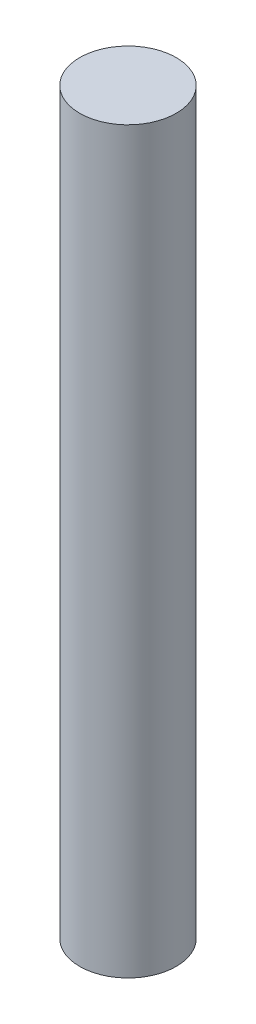
ISO-10303-21;
HEADER;
FILE_DESCRIPTION(('STEP AP214'),'2;1');
FILE_NAME('part.step','',(''),(''),'','','');
FILE_SCHEMA(('AUTOMOTIVE_DESIGN { 1 0 10303 214 1 1 1 1 }'));
ENDSEC;
DATA;
#1=APPLICATION_CONTEXT('core data for automotive mechanical design processes');
#2=APPLICATION_PROTOCOL_DEFINITION('international standard','automotive_design',2000,#1);
#3=PRODUCT_CONTEXT('',#1,'mechanical');
#4=PRODUCT('Part','Part','',(#3));
#5=PRODUCT_RELATED_PRODUCT_CATEGORY('part','',(#4));
#6=PRODUCT_DEFINITION_FORMATION('','',#4);
#7=PRODUCT_DEFINITION_CONTEXT('part definition',#1,'design');
#8=PRODUCT_DEFINITION('design','',#6,#7);
#9=PRODUCT_DEFINITION_SHAPE('','',#8);
#10=(LENGTH_UNIT() NAMED_UNIT(*) SI_UNIT(.MILLI.,.METRE.));
#11=(NAMED_UNIT(*) PLANE_ANGLE_UNIT() SI_UNIT($,.RADIAN.));
#12=(NAMED_UNIT(*) SI_UNIT($,.STERADIAN.) SOLID_ANGLE_UNIT());
#13=UNCERTAINTY_MEASURE_WITH_UNIT(LENGTH_MEASURE(1.E-05),#10,'distance_accuracy_value','');
#14=(GEOMETRIC_REPRESENTATION_CONTEXT(3) GLOBAL_UNCERTAINTY_ASSIGNED_CONTEXT((#13)) GLOBAL_UNIT_ASSIGNED_CONTEXT((#10,
#11,#12)) REPRESENTATION_CONTEXT('',''));
#15=CARTESIAN_POINT('',(0.,0.,0.));
#16=DIRECTION('',(0.,0.,1.));
#17=DIRECTION('',(1.,0.,0.));
#18=AXIS2_PLACEMENT_3D('',#15,#16,#17);
#19=CARTESIAN_POINT('',(0.,3048.,0.));
#20=DIRECTION('',(0.,-1.,0.));
#21=DIRECTION('',(0.,0.,-1.));
#22=AXIS2_PLACEMENT_3D('',#19,#20,#21);
#23=CYLINDRICAL_SURFACE('',#22,199.136);
#24=CARTESIAN_POINT('',(0.,3048.,0.));
#25=DIRECTION('',(0.,1.,0.));
#26=DIRECTION('',(0.,0.,1.));
#27=AXIS2_PLACEMENT_3D('',#24,#25,#26);
#28=CIRCLE('',#27,199.136);
#29=CARTESIAN_POINT('',(0.,3048.,199.136));
#30=VERTEX_POINT('',#29);
#31=EDGE_CURVE('E10',#30,#30,#28,.T.);
#32=ORIENTED_EDGE('',*,*,#31,.F.);
#33=EDGE_LOOP('',(#32));
#34=FACE_BOUND('',#33,.T.);
#35=CARTESIAN_POINT('',(0.,0.,0.));
#36=DIRECTION('',(0.,1.,0.));
#37=DIRECTION('',(0.,0.,1.));
#38=AXIS2_PLACEMENT_3D('',#35,#36,#37);
#39=CIRCLE('',#38,199.136);
#40=CARTESIAN_POINT('',(0.,0.,199.136));
#41=VERTEX_POINT('',#40);
#42=EDGE_CURVE('E44',#41,#41,#39,.T.);
#43=ORIENTED_EDGE('',*,*,#42,.T.);
#44=EDGE_LOOP('',(#43));
#45=FACE_BOUND('',#44,.T.);
#46=ADVANCED_FACE('F41',(#34,#45),#23,.T.);
#47=CARTESIAN_POINT('',(0.,3048.,0.));
#48=DIRECTION('',(0.,1.,0.));
#49=DIRECTION('',(0.,0.,1.));
#50=AXIS2_PLACEMENT_3D('',#47,#48,#49);
#51=PLANE('',#50);
#52=ORIENTED_EDGE('',*,*,#31,.T.);
#53=EDGE_LOOP('',(#52));
#54=FACE_BOUND('',#53,.T.);
#55=ADVANCED_FACE('F58',(#54),#51,.T.);
#56=CARTESIAN_POINT('',(0.,0.,0.));
#57=DIRECTION('',(0.,1.,0.));
#58=DIRECTION('',(0.,0.,1.));
#59=AXIS2_PLACEMENT_3D('',#56,#57,#58);
#60=PLANE('',#59);
#61=ORIENTED_EDGE('',*,*,#42,.F.);
#62=EDGE_LOOP('',(#61));
#63=FACE_BOUND('',#62,.T.);
#64=ADVANCED_FACE('F56',(#63),#60,.F.);
#65=CLOSED_SHELL('',(#46,#55,#64));
#66=MANIFOLD_SOLID_BREP('B2',#65);
#67=ADVANCED_BREP_SHAPE_REPRESENTATION('',(#18,#66),#14);
#68=SHAPE_DEFINITION_REPRESENTATION(#9,#67);
ENDSEC;
END-ISO-10303-21;
